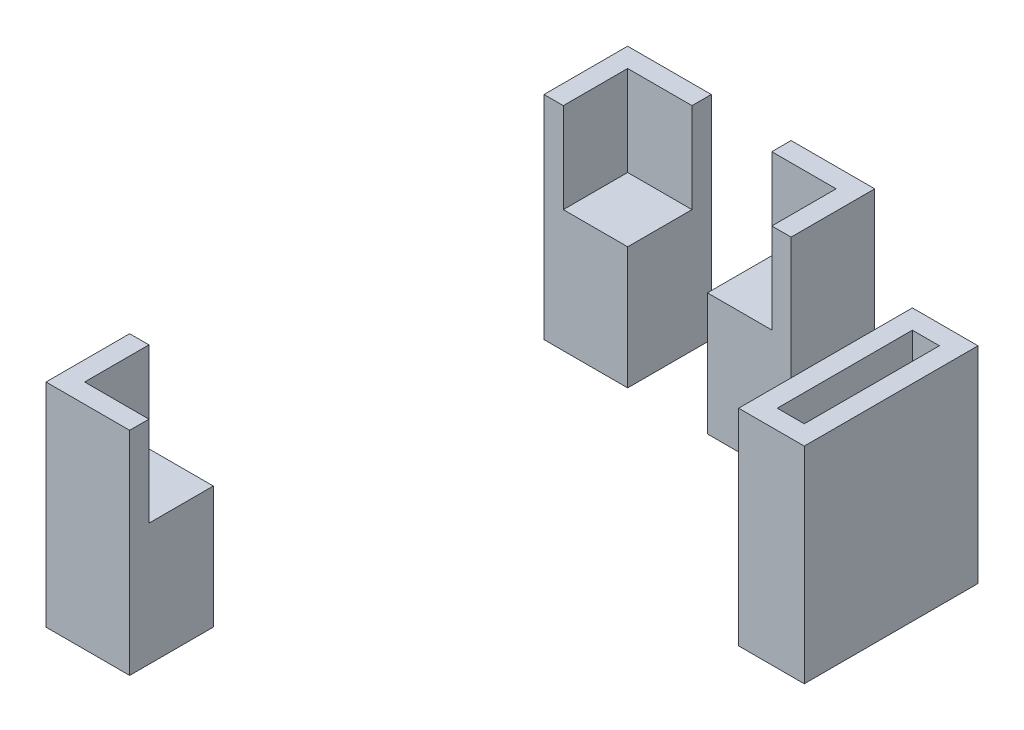
ISO-10303-21;
HEADER;
FILE_DESCRIPTION(('STEP AP214'),'2;1');
FILE_NAME('part.step','',(''),(''),'','','');
FILE_SCHEMA(('AUTOMOTIVE_DESIGN { 1 0 10303 214 1 1 1 1 }'));
ENDSEC;
DATA;
#1=APPLICATION_CONTEXT('core data for automotive mechanical design processes');
#2=APPLICATION_PROTOCOL_DEFINITION('international standard','automotive_design',2000,#1);
#3=PRODUCT_CONTEXT('',#1,'mechanical');
#4=PRODUCT('Part','Part','',(#3));
#5=PRODUCT_RELATED_PRODUCT_CATEGORY('part','',(#4));
#6=PRODUCT_DEFINITION_FORMATION('','',#4);
#7=PRODUCT_DEFINITION_CONTEXT('part definition',#1,'design');
#8=PRODUCT_DEFINITION('design','',#6,#7);
#9=PRODUCT_DEFINITION_SHAPE('','',#8);
#10=(LENGTH_UNIT() NAMED_UNIT(*) SI_UNIT(.MILLI.,.METRE.));
#11=(NAMED_UNIT(*) PLANE_ANGLE_UNIT() SI_UNIT($,.RADIAN.));
#12=(NAMED_UNIT(*) SI_UNIT($,.STERADIAN.) SOLID_ANGLE_UNIT());
#13=UNCERTAINTY_MEASURE_WITH_UNIT(LENGTH_MEASURE(1.E-05),#10,'distance_accuracy_value','');
#14=(GEOMETRIC_REPRESENTATION_CONTEXT(3) GLOBAL_UNCERTAINTY_ASSIGNED_CONTEXT((#13)) GLOBAL_UNIT_ASSIGNED_CONTEXT((#10,
#11,#12)) REPRESENTATION_CONTEXT('',''));
#15=CARTESIAN_POINT('',(0.,0.,0.));
#16=DIRECTION('',(0.,0.,1.));
#17=DIRECTION('',(1.,0.,0.));
#18=AXIS2_PLACEMENT_3D('',#15,#16,#17);
#19=CARTESIAN_POINT('',(26.675,16.5,4.55));
#20=DIRECTION('',(1.,0.,0.));
#21=DIRECTION('',(0.,0.,-1.));
#22=AXIS2_PLACEMENT_3D('',#19,#20,#21);
#23=PLANE('',#22);
#24=DIRECTION('',(0.,0.,1.));
#25=VECTOR('',#24,1.);
#26=CARTESIAN_POINT('',(26.675,16.,4.55));
#27=LINE('',#26,#25);
#28=CARTESIAN_POINT('',(26.675,16.,4.55));
#29=VERTEX_POINT('',#28);
#30=CARTESIAN_POINT('',(26.675,16.,18.05));
#31=VERTEX_POINT('',#30);
#32=EDGE_CURVE('E134',#29,#31,#27,.T.);
#33=ORIENTED_EDGE('',*,*,#32,.F.);
#34=DIRECTION('',(0.,-1.,0.));
#35=VECTOR('',#34,1.);
#36=CARTESIAN_POINT('',(26.675,16.5,4.55));
#37=LINE('',#36,#35);
#38=CARTESIAN_POINT('',(26.675,0.,4.55));
#39=VERTEX_POINT('',#38);
#40=EDGE_CURVE('E165',#29,#39,#37,.T.);
#41=ORIENTED_EDGE('',*,*,#40,.T.);
#42=DIRECTION('',(0.,0.,1.));
#43=VECTOR('',#42,1.);
#44=CARTESIAN_POINT('',(26.675,0.,4.55));
#45=LINE('',#44,#43);
#46=CARTESIAN_POINT('',(26.675,0.,18.05));
#47=VERTEX_POINT('',#46);
#48=EDGE_CURVE('E153',#39,#47,#45,.T.);
#49=ORIENTED_EDGE('',*,*,#48,.T.);
#50=DIRECTION('',(0.,-1.,0.));
#51=VECTOR('',#50,1.);
#52=CARTESIAN_POINT('',(26.675,16.5,18.05));
#53=LINE('',#52,#51);
#54=EDGE_CURVE('E54',#31,#47,#53,.T.);
#55=ORIENTED_EDGE('',*,*,#54,.F.);
#56=EDGE_LOOP('',(#33,#41,#49,#55));
#57=FACE_BOUND('',#56,.T.);
#58=ADVANCED_FACE('F47',(#57),#23,.F.);
#59=CARTESIAN_POINT('',(26.675,16.5,18.05));
#60=DIRECTION('',(0.,0.,-1.));
#61=DIRECTION('',(-1.,0.,0.));
#62=AXIS2_PLACEMENT_3D('',#59,#60,#61);
#63=PLANE('',#62);
#64=DIRECTION('',(1.,0.,0.));
#65=VECTOR('',#64,1.);
#66=CARTESIAN_POINT('',(26.675,16.,18.05));
#67=LINE('',#66,#65);
#68=CARTESIAN_POINT('',(31.775,16.,18.05));
#69=VERTEX_POINT('',#68);
#70=EDGE_CURVE('E136',#31,#69,#67,.T.);
#71=ORIENTED_EDGE('',*,*,#70,.F.);
#72=ORIENTED_EDGE('',*,*,#54,.T.);
#73=DIRECTION('',(1.,0.,0.));
#74=VECTOR('',#73,1.);
#75=CARTESIAN_POINT('',(26.675,0.,18.05));
#76=LINE('',#75,#74);
#77=CARTESIAN_POINT('',(31.775,0.,18.05));
#78=VERTEX_POINT('',#77);
#79=EDGE_CURVE('E156',#47,#78,#76,.T.);
#80=ORIENTED_EDGE('',*,*,#79,.T.);
#81=DIRECTION('',(0.,-1.,0.));
#82=VECTOR('',#81,1.);
#83=CARTESIAN_POINT('',(31.775,16.5,18.05));
#84=LINE('',#83,#82);
#85=EDGE_CURVE('E169',#69,#78,#84,.T.);
#86=ORIENTED_EDGE('',*,*,#85,.F.);
#87=EDGE_LOOP('',(#71,#72,#80,#86));
#88=FACE_BOUND('',#87,.T.);
#89=ADVANCED_FACE('F174',(#88),#63,.F.);
#90=CARTESIAN_POINT('',(31.775,16.5,4.55));
#91=DIRECTION('',(-1.,0.,0.));
#92=DIRECTION('',(0.,0.,1.));
#93=AXIS2_PLACEMENT_3D('',#90,#91,#92);
#94=PLANE('',#93);
#95=DIRECTION('',(0.,0.,-1.));
#96=VECTOR('',#95,1.);
#97=CARTESIAN_POINT('',(31.775,16.,4.55));
#98=LINE('',#97,#96);
#99=CARTESIAN_POINT('',(31.775,16.,4.55));
#100=VERTEX_POINT('',#99);
#101=EDGE_CURVE('E138',#69,#100,#98,.T.);
#102=ORIENTED_EDGE('',*,*,#101,.F.);
#103=ORIENTED_EDGE('',*,*,#85,.T.);
#104=DIRECTION('',(0.,0.,-1.));
#105=VECTOR('',#104,1.);
#106=CARTESIAN_POINT('',(31.775,0.,4.55));
#107=LINE('',#106,#105);
#108=CARTESIAN_POINT('',(31.775,0.,4.55));
#109=VERTEX_POINT('',#108);
#110=EDGE_CURVE('E159',#78,#109,#107,.T.);
#111=ORIENTED_EDGE('',*,*,#110,.T.);
#112=DIRECTION('',(0.,-1.,0.));
#113=VECTOR('',#112,1.);
#114=CARTESIAN_POINT('',(31.775,16.5,4.55));
#115=LINE('',#114,#113);
#116=EDGE_CURVE('E167',#100,#109,#115,.T.);
#117=ORIENTED_EDGE('',*,*,#116,.F.);
#118=EDGE_LOOP('',(#102,#103,#111,#117));
#119=FACE_BOUND('',#118,.T.);
#120=ADVANCED_FACE('F190',(#119),#94,.F.);
#121=CARTESIAN_POINT('',(26.675,16.5,4.55));
#122=DIRECTION('',(0.,0.,1.));
#123=DIRECTION('',(1.,0.,0.));
#124=AXIS2_PLACEMENT_3D('',#121,#122,#123);
#125=PLANE('',#124);
#126=DIRECTION('',(-1.,0.,0.));
#127=VECTOR('',#126,1.);
#128=CARTESIAN_POINT('',(26.675,16.,4.55));
#129=LINE('',#128,#127);
#130=EDGE_CURVE('E140',#100,#29,#129,.T.);
#131=ORIENTED_EDGE('',*,*,#130,.F.);
#132=ORIENTED_EDGE('',*,*,#116,.T.);
#133=DIRECTION('',(-1.,0.,0.));
#134=VECTOR('',#133,1.);
#135=CARTESIAN_POINT('',(26.675,0.,4.55));
#136=LINE('',#135,#134);
#137=EDGE_CURVE('E162',#109,#39,#136,.T.);
#138=ORIENTED_EDGE('',*,*,#137,.T.);
#139=ORIENTED_EDGE('',*,*,#40,.F.);
#140=EDGE_LOOP('',(#131,#132,#138,#139));
#141=FACE_BOUND('',#140,.T.);
#142=ADVANCED_FACE('F186',(#141),#125,.F.);
#143=CARTESIAN_POINT('',(28.175,16.5,6.05));
#144=DIRECTION('',(1.,0.,0.));
#145=DIRECTION('',(0.,0.,-1.));
#146=AXIS2_PLACEMENT_3D('',#143,#144,#145);
#147=PLANE('',#146);
#148=DIRECTION('',(0.,0.,1.));
#149=VECTOR('',#148,1.);
#150=CARTESIAN_POINT('',(28.175,13.,6.05));
#151=LINE('',#150,#149);
#152=CARTESIAN_POINT('',(28.175,13.,6.05));
#153=VERTEX_POINT('',#152);
#154=CARTESIAN_POINT('',(28.175,13.,16.55));
#155=VERTEX_POINT('',#154);
#156=EDGE_CURVE('E125',#153,#155,#151,.T.);
#157=ORIENTED_EDGE('',*,*,#156,.F.);
#158=DIRECTION('',(0.,-1.,0.));
#159=VECTOR('',#158,1.);
#160=CARTESIAN_POINT('',(28.175,16.5,6.05));
#161=LINE('',#160,#159);
#162=CARTESIAN_POINT('',(28.175,16.,6.05));
#163=VERTEX_POINT('',#162);
#164=EDGE_CURVE('E113',#163,#153,#161,.T.);
#165=ORIENTED_EDGE('',*,*,#164,.F.);
#166=DIRECTION('',(0.,0.,1.));
#167=VECTOR('',#166,1.);
#168=CARTESIAN_POINT('',(28.175,16.,6.05));
#169=LINE('',#168,#167);
#170=CARTESIAN_POINT('',(28.175,16.,16.55));
#171=VERTEX_POINT('',#170);
#172=EDGE_CURVE('E122',#163,#171,#169,.T.);
#173=ORIENTED_EDGE('',*,*,#172,.T.);
#174=DIRECTION('',(0.,-1.,0.));
#175=VECTOR('',#174,1.);
#176=CARTESIAN_POINT('',(28.175,16.5,16.55));
#177=LINE('',#176,#175);
#178=EDGE_CURVE('E127',#171,#155,#177,.T.);
#179=ORIENTED_EDGE('',*,*,#178,.T.);
#180=EDGE_LOOP('',(#157,#165,#173,#179));
#181=FACE_BOUND('',#180,.T.);
#182=ADVANCED_FACE('F126',(#181),#147,.T.);
#183=CARTESIAN_POINT('',(28.175,16.5,16.55));
#184=DIRECTION('',(0.,0.,-1.));
#185=DIRECTION('',(-1.,0.,0.));
#186=AXIS2_PLACEMENT_3D('',#183,#184,#185);
#187=PLANE('',#186);
#188=DIRECTION('',(1.,0.,0.));
#189=VECTOR('',#188,1.);
#190=CARTESIAN_POINT('',(28.175,13.,16.55));
#191=LINE('',#190,#189);
#192=CARTESIAN_POINT('',(30.275,13.,16.55));
#193=VERTEX_POINT('',#192);
#194=EDGE_CURVE('E61',#155,#193,#191,.T.);
#195=ORIENTED_EDGE('',*,*,#194,.F.);
#196=ORIENTED_EDGE('',*,*,#178,.F.);
#197=DIRECTION('',(1.,0.,0.));
#198=VECTOR('',#197,1.);
#199=CARTESIAN_POINT('',(28.175,16.,16.55));
#200=LINE('',#199,#198);
#201=CARTESIAN_POINT('',(30.275,16.,16.55));
#202=VERTEX_POINT('',#201);
#203=EDGE_CURVE('E145',#171,#202,#200,.T.);
#204=ORIENTED_EDGE('',*,*,#203,.T.);
#205=DIRECTION('',(0.,-1.,0.));
#206=VECTOR('',#205,1.);
#207=CARTESIAN_POINT('',(30.275,16.5,16.55));
#208=LINE('',#207,#206);
#209=EDGE_CURVE('E150',#202,#193,#208,.T.);
#210=ORIENTED_EDGE('',*,*,#209,.T.);
#211=EDGE_LOOP('',(#195,#196,#204,#210));
#212=FACE_BOUND('',#211,.T.);
#213=ADVANCED_FACE('F216',(#212),#187,.T.);
#214=CARTESIAN_POINT('',(30.275,16.5,6.05));
#215=DIRECTION('',(-1.,0.,0.));
#216=DIRECTION('',(0.,0.,1.));
#217=AXIS2_PLACEMENT_3D('',#214,#215,#216);
#218=PLANE('',#217);
#219=DIRECTION('',(0.,0.,-1.));
#220=VECTOR('',#219,1.);
#221=CARTESIAN_POINT('',(30.275,13.,6.05));
#222=LINE('',#221,#220);
#223=CARTESIAN_POINT('',(30.275,13.,6.05));
#224=VERTEX_POINT('',#223);
#225=EDGE_CURVE('E69',#193,#224,#222,.T.);
#226=ORIENTED_EDGE('',*,*,#225,.F.);
#227=ORIENTED_EDGE('',*,*,#209,.F.);
#228=DIRECTION('',(0.,0.,-1.));
#229=VECTOR('',#228,1.);
#230=CARTESIAN_POINT('',(30.275,16.,6.05));
#231=LINE('',#230,#229);
#232=CARTESIAN_POINT('',(30.275,16.,6.05));
#233=VERTEX_POINT('',#232);
#234=EDGE_CURVE('E142',#202,#233,#231,.T.);
#235=ORIENTED_EDGE('',*,*,#234,.T.);
#236=DIRECTION('',(0.,-1.,0.));
#237=VECTOR('',#236,1.);
#238=CARTESIAN_POINT('',(30.275,16.5,6.05));
#239=LINE('',#238,#237);
#240=EDGE_CURVE('E121',#233,#224,#239,.T.);
#241=ORIENTED_EDGE('',*,*,#240,.T.);
#242=EDGE_LOOP('',(#226,#227,#235,#241));
#243=FACE_BOUND('',#242,.T.);
#244=ADVANCED_FACE('F219',(#243),#218,.T.);
#245=CARTESIAN_POINT('',(28.175,16.5,6.05));
#246=DIRECTION('',(0.,0.,1.));
#247=DIRECTION('',(1.,0.,0.));
#248=AXIS2_PLACEMENT_3D('',#245,#246,#247);
#249=PLANE('',#248);
#250=DIRECTION('',(-1.,0.,0.));
#251=VECTOR('',#250,1.);
#252=CARTESIAN_POINT('',(28.175,13.,6.05));
#253=LINE('',#252,#251);
#254=EDGE_CURVE('E118',#224,#153,#253,.T.);
#255=ORIENTED_EDGE('',*,*,#254,.F.);
#256=ORIENTED_EDGE('',*,*,#240,.F.);
#257=DIRECTION('',(-1.,0.,0.));
#258=VECTOR('',#257,1.);
#259=CARTESIAN_POINT('',(28.175,16.,6.05));
#260=LINE('',#259,#258);
#261=EDGE_CURVE('E13',#233,#163,#260,.T.);
#262=ORIENTED_EDGE('',*,*,#261,.T.);
#263=ORIENTED_EDGE('',*,*,#164,.T.);
#264=EDGE_LOOP('',(#255,#256,#262,#263));
#265=FACE_BOUND('',#264,.T.);
#266=ADVANCED_FACE('F115',(#265),#249,.T.);
#267=CARTESIAN_POINT('',(0.,0.,0.));
#268=DIRECTION('',(0.,1.,0.));
#269=DIRECTION('',(0.,0.,1.));
#270=AXIS2_PLACEMENT_3D('',#267,#268,#269);
#271=PLANE('',#270);
#272=ORIENTED_EDGE('',*,*,#48,.F.);
#273=ORIENTED_EDGE('',*,*,#137,.F.);
#274=ORIENTED_EDGE('',*,*,#110,.F.);
#275=ORIENTED_EDGE('',*,*,#79,.F.);
#276=EDGE_LOOP('',(#272,#273,#274,#275));
#277=FACE_BOUND('',#276,.T.);
#278=ADVANCED_FACE('F181',(#277),#271,.F.);
#279=CARTESIAN_POINT('',(0.,16.,0.));
#280=DIRECTION('',(0.,1.,0.));
#281=DIRECTION('',(0.,0.,1.));
#282=AXIS2_PLACEMENT_3D('',#279,#280,#281);
#283=PLANE('',#282);
#284=ORIENTED_EDGE('',*,*,#261,.F.);
#285=ORIENTED_EDGE('',*,*,#234,.F.);
#286=ORIENTED_EDGE('',*,*,#203,.F.);
#287=ORIENTED_EDGE('',*,*,#172,.F.);
#288=EDGE_LOOP('',(#284,#285,#286,#287));
#289=FACE_BOUND('',#288,.T.);
#290=ORIENTED_EDGE('',*,*,#32,.T.);
#291=ORIENTED_EDGE('',*,*,#70,.T.);
#292=ORIENTED_EDGE('',*,*,#101,.T.);
#293=ORIENTED_EDGE('',*,*,#130,.T.);
#294=EDGE_LOOP('',(#290,#291,#292,#293));
#295=FACE_BOUND('',#294,.T.);
#296=ADVANCED_FACE('F192',(#289,#295),#283,.T.);
#297=CARTESIAN_POINT('',(0.,13.,0.));
#298=DIRECTION('',(0.,1.,0.));
#299=DIRECTION('',(0.,0.,1.));
#300=AXIS2_PLACEMENT_3D('',#297,#298,#299);
#301=PLANE('',#300);
#302=ORIENTED_EDGE('',*,*,#254,.T.);
#303=ORIENTED_EDGE('',*,*,#156,.T.);
#304=ORIENTED_EDGE('',*,*,#194,.T.);
#305=ORIENTED_EDGE('',*,*,#225,.T.);
#306=EDGE_LOOP('',(#302,#303,#304,#305));
#307=FACE_BOUND('',#306,.T.);
#308=ADVANCED_FACE('F130',(#307),#301,.T.);
#309=CLOSED_SHELL('',(#58,#89,#120,#142,#182,#213,#244,#266,#278,#296,#308));
#310=MANIFOLD_SOLID_BREP('B2',#309);
#311=CARTESIAN_POINT('',(-1.5,16.5,37.2));
#312=DIRECTION('',(0.,0.,1.));
#313=DIRECTION('',(1.,0.,0.));
#314=AXIS2_PLACEMENT_3D('',#311,#312,#313);
#315=PLANE('',#314);
#316=DIRECTION('',(-1.,0.,0.));
#317=VECTOR('',#316,1.);
#318=CARTESIAN_POINT('',(-1.5,0.,37.2));
#319=LINE('',#318,#317);
#320=CARTESIAN_POINT('',(5.,0.,37.2));
#321=VERTEX_POINT('',#320);
#322=CARTESIAN_POINT('',(-1.5,0.,37.2));
#323=VERTEX_POINT('',#322);
#324=EDGE_CURVE('E373',#321,#323,#319,.T.);
#325=ORIENTED_EDGE('',*,*,#324,.T.);
#326=DIRECTION('',(0.,-1.,0.));
#327=VECTOR('',#326,1.);
#328=CARTESIAN_POINT('',(-1.5,16.5,37.2));
#329=LINE('',#328,#327);
#330=CARTESIAN_POINT('',(-1.5,16.5,37.2));
#331=VERTEX_POINT('',#330);
#332=EDGE_CURVE('E45',#331,#323,#329,.T.);
#333=ORIENTED_EDGE('',*,*,#332,.F.);
#334=DIRECTION('',(-1.,0.,0.));
#335=VECTOR('',#334,1.);
#336=CARTESIAN_POINT('',(-1.5,16.5,37.2));
#337=LINE('',#336,#335);
#338=CARTESIAN_POINT('',(0.,16.5,37.2));
#339=VERTEX_POINT('',#338);
#340=EDGE_CURVE('E382',#339,#331,#337,.T.);
#341=ORIENTED_EDGE('',*,*,#340,.F.);
#342=DIRECTION('',(0.,-1.,0.));
#343=VECTOR('',#342,1.);
#344=CARTESIAN_POINT('',(0.,16.5,37.2));
#345=LINE('',#344,#343);
#346=CARTESIAN_POINT('',(0.,9.5,37.2));
#347=VERTEX_POINT('',#346);
#348=EDGE_CURVE('E378',#339,#347,#345,.T.);
#349=ORIENTED_EDGE('',*,*,#348,.T.);
#350=DIRECTION('',(-1.,0.,0.));
#351=VECTOR('',#350,1.);
#352=CARTESIAN_POINT('',(0.,9.5,37.2));
#353=LINE('',#352,#351);
#354=CARTESIAN_POINT('',(5.,9.5,37.2));
#355=VERTEX_POINT('',#354);
#356=EDGE_CURVE('E361',#355,#347,#353,.T.);
#357=ORIENTED_EDGE('',*,*,#356,.F.);
#358=DIRECTION('',(0.,-1.,0.));
#359=VECTOR('',#358,1.);
#360=CARTESIAN_POINT('',(5.,9.5,37.2));
#361=LINE('',#360,#359);
#362=EDGE_CURVE('E366',#355,#321,#361,.T.);
#363=ORIENTED_EDGE('',*,*,#362,.T.);
#364=EDGE_LOOP('',(#325,#333,#341,#349,#357,#363));
#365=FACE_BOUND('',#364,.T.);
#366=ADVANCED_FACE('F298',(#365),#315,.F.);
#367=CARTESIAN_POINT('',(-1.5,16.5,37.2));
#368=DIRECTION('',(1.,0.,0.));
#369=DIRECTION('',(0.,0.,-1.));
#370=AXIS2_PLACEMENT_3D('',#367,#368,#369);
#371=PLANE('',#370);
#372=DIRECTION('',(0.,0.,1.));
#373=VECTOR('',#372,1.);
#374=CARTESIAN_POINT('',(-1.5,0.,37.2));
#375=LINE('',#374,#373);
#376=CARTESIAN_POINT('',(-1.5,0.,43.7));
#377=VERTEX_POINT('',#376);
#378=EDGE_CURVE('E396',#323,#377,#375,.T.);
#379=ORIENTED_EDGE('',*,*,#378,.T.);
#380=DIRECTION('',(0.,-1.,0.));
#381=VECTOR('',#380,1.);
#382=CARTESIAN_POINT('',(-1.5,16.5,43.7));
#383=LINE('',#382,#381);
#384=CARTESIAN_POINT('',(-1.5,16.5,43.7));
#385=VERTEX_POINT('',#384);
#386=EDGE_CURVE('E305',#385,#377,#383,.T.);
#387=ORIENTED_EDGE('',*,*,#386,.F.);
#388=DIRECTION('',(0.,0.,1.));
#389=VECTOR('',#388,1.);
#390=CARTESIAN_POINT('',(-1.5,16.5,37.2));
#391=LINE('',#390,#389);
#392=EDGE_CURVE('E385',#331,#385,#391,.T.);
#393=ORIENTED_EDGE('',*,*,#392,.F.);
#394=ORIENTED_EDGE('',*,*,#332,.T.);
#395=EDGE_LOOP('',(#379,#387,#393,#394));
#396=FACE_BOUND('',#395,.T.);
#397=ADVANCED_FACE('F417',(#396),#371,.F.);
#398=CARTESIAN_POINT('',(-1.5,16.5,43.7));
#399=DIRECTION('',(0.,0.,-1.));
#400=DIRECTION('',(-1.,0.,0.));
#401=AXIS2_PLACEMENT_3D('',#398,#399,#400);
#402=PLANE('',#401);
#403=DIRECTION('',(1.,0.,0.));
#404=VECTOR('',#403,1.);
#405=CARTESIAN_POINT('',(-1.5,0.,43.7));
#406=LINE('',#405,#404);
#407=CARTESIAN_POINT('',(5.,0.,43.7));
#408=VERTEX_POINT('',#407);
#409=EDGE_CURVE('E398',#377,#408,#406,.T.);
#410=ORIENTED_EDGE('',*,*,#409,.T.);
#411=DIRECTION('',(0.,-1.,0.));
#412=VECTOR('',#411,1.);
#413=CARTESIAN_POINT('',(5.,16.5,43.7));
#414=LINE('',#413,#412);
#415=CARTESIAN_POINT('',(5.,16.5,43.7));
#416=VERTEX_POINT('',#415);
#417=EDGE_CURVE('E405',#416,#408,#414,.T.);
#418=ORIENTED_EDGE('',*,*,#417,.F.);
#419=DIRECTION('',(1.,0.,0.));
#420=VECTOR('',#419,1.);
#421=CARTESIAN_POINT('',(-1.5,16.5,43.7));
#422=LINE('',#421,#420);
#423=EDGE_CURVE('E387',#385,#416,#422,.T.);
#424=ORIENTED_EDGE('',*,*,#423,.F.);
#425=ORIENTED_EDGE('',*,*,#386,.T.);
#426=EDGE_LOOP('',(#410,#418,#424,#425));
#427=FACE_BOUND('',#426,.T.);
#428=ADVANCED_FACE('F411',(#427),#402,.F.);
#429=CARTESIAN_POINT('',(5.,16.5,42.2));
#430=DIRECTION('',(-1.,0.,0.));
#431=DIRECTION('',(0.,0.,1.));
#432=AXIS2_PLACEMENT_3D('',#429,#430,#431);
#433=PLANE('',#432);
#434=DIRECTION('',(0.,0.,-1.));
#435=VECTOR('',#434,1.);
#436=CARTESIAN_POINT('',(5.,0.,42.2));
#437=LINE('',#436,#435);
#438=EDGE_CURVE('E370',#408,#321,#437,.T.);
#439=ORIENTED_EDGE('',*,*,#438,.T.);
#440=ORIENTED_EDGE('',*,*,#362,.F.);
#441=DIRECTION('',(0.,0.,-1.));
#442=VECTOR('',#441,1.);
#443=CARTESIAN_POINT('',(5.,9.5,37.2));
#444=LINE('',#443,#442);
#445=CARTESIAN_POINT('',(5.,9.5,42.2));
#446=VERTEX_POINT('',#445);
#447=EDGE_CURVE('E356',#446,#355,#444,.T.);
#448=ORIENTED_EDGE('',*,*,#447,.F.);
#449=DIRECTION('',(0.,-1.,0.));
#450=VECTOR('',#449,1.);
#451=CARTESIAN_POINT('',(5.,16.5,42.2));
#452=LINE('',#451,#450);
#453=CARTESIAN_POINT('',(5.,16.5,42.2));
#454=VERTEX_POINT('',#453);
#455=EDGE_CURVE('E312',#454,#446,#452,.T.);
#456=ORIENTED_EDGE('',*,*,#455,.F.);
#457=DIRECTION('',(0.,0.,-1.));
#458=VECTOR('',#457,1.);
#459=CARTESIAN_POINT('',(5.,16.5,42.2));
#460=LINE('',#459,#458);
#461=EDGE_CURVE('E389',#416,#454,#460,.T.);
#462=ORIENTED_EDGE('',*,*,#461,.F.);
#463=ORIENTED_EDGE('',*,*,#417,.T.);
#464=EDGE_LOOP('',(#439,#440,#448,#456,#462,#463));
#465=FACE_BOUND('',#464,.T.);
#466=ADVANCED_FACE('F367',(#465),#433,.F.);
#467=CARTESIAN_POINT('',(0.,16.5,42.2));
#468=DIRECTION('',(0.,0.,1.));
#469=DIRECTION('',(1.,0.,0.));
#470=AXIS2_PLACEMENT_3D('',#467,#468,#469);
#471=PLANE('',#470);
#472=ORIENTED_EDGE('',*,*,#455,.T.);
#473=DIRECTION('',(1.,0.,0.));
#474=VECTOR('',#473,1.);
#475=CARTESIAN_POINT('',(0.,9.5,42.2));
#476=LINE('',#475,#474);
#477=CARTESIAN_POINT('',(0.,9.5,42.2));
#478=VERTEX_POINT('',#477);
#479=EDGE_CURVE('E316',#478,#446,#476,.T.);
#480=ORIENTED_EDGE('',*,*,#479,.F.);
#481=DIRECTION('',(0.,-1.,0.));
#482=VECTOR('',#481,1.);
#483=CARTESIAN_POINT('',(0.,16.5,42.2));
#484=LINE('',#483,#482);
#485=CARTESIAN_POINT('',(0.,16.5,42.2));
#486=VERTEX_POINT('',#485);
#487=EDGE_CURVE('E402',#486,#478,#484,.T.);
#488=ORIENTED_EDGE('',*,*,#487,.F.);
#489=DIRECTION('',(-1.,0.,0.));
#490=VECTOR('',#489,1.);
#491=CARTESIAN_POINT('',(0.,16.5,42.2));
#492=LINE('',#491,#490);
#493=EDGE_CURVE('E391',#454,#486,#492,.T.);
#494=ORIENTED_EDGE('',*,*,#493,.F.);
#495=EDGE_LOOP('',(#472,#480,#488,#494));
#496=FACE_BOUND('',#495,.T.);
#497=ADVANCED_FACE('F425',(#496),#471,.F.);
#498=CARTESIAN_POINT('',(0.,16.5,37.2));
#499=DIRECTION('',(-1.,0.,0.));
#500=DIRECTION('',(0.,0.,1.));
#501=AXIS2_PLACEMENT_3D('',#498,#499,#500);
#502=PLANE('',#501);
#503=ORIENTED_EDGE('',*,*,#487,.T.);
#504=DIRECTION('',(0.,0.,1.));
#505=VECTOR('',#504,1.);
#506=CARTESIAN_POINT('',(0.,9.5,37.2));
#507=LINE('',#506,#505);
#508=EDGE_CURVE('E423',#347,#478,#507,.T.);
#509=ORIENTED_EDGE('',*,*,#508,.F.);
#510=ORIENTED_EDGE('',*,*,#348,.F.);
#511=DIRECTION('',(0.,0.,-1.));
#512=VECTOR('',#511,1.);
#513=CARTESIAN_POINT('',(0.,16.5,37.2));
#514=LINE('',#513,#512);
#515=EDGE_CURVE('E393',#486,#339,#514,.T.);
#516=ORIENTED_EDGE('',*,*,#515,.F.);
#517=EDGE_LOOP('',(#503,#509,#510,#516));
#518=FACE_BOUND('',#517,.T.);
#519=ADVANCED_FACE('F422',(#518),#502,.F.);
#520=CARTESIAN_POINT('',(0.,16.5,0.));
#521=DIRECTION('',(0.,-1.,0.));
#522=DIRECTION('',(0.,0.,-1.));
#523=AXIS2_PLACEMENT_3D('',#520,#521,#522);
#524=PLANE('',#523);
#525=ORIENTED_EDGE('',*,*,#340,.T.);
#526=ORIENTED_EDGE('',*,*,#392,.T.);
#527=ORIENTED_EDGE('',*,*,#423,.T.);
#528=ORIENTED_EDGE('',*,*,#461,.T.);
#529=ORIENTED_EDGE('',*,*,#493,.T.);
#530=ORIENTED_EDGE('',*,*,#515,.T.);
#531=EDGE_LOOP('',(#525,#526,#527,#528,#529,#530));
#532=FACE_BOUND('',#531,.T.);
#533=ADVANCED_FACE('F419',(#532),#524,.F.);
#534=CARTESIAN_POINT('',(0.,0.,0.));
#535=DIRECTION('',(0.,-1.,0.));
#536=DIRECTION('',(0.,0.,-1.));
#537=AXIS2_PLACEMENT_3D('',#534,#535,#536);
#538=PLANE('',#537);
#539=ORIENTED_EDGE('',*,*,#324,.F.);
#540=ORIENTED_EDGE('',*,*,#438,.F.);
#541=ORIENTED_EDGE('',*,*,#409,.F.);
#542=ORIENTED_EDGE('',*,*,#378,.F.);
#543=EDGE_LOOP('',(#539,#540,#541,#542));
#544=FACE_BOUND('',#543,.T.);
#545=ADVANCED_FACE('F415',(#544),#538,.T.);
#546=CARTESIAN_POINT('',(0.,9.5,0.));
#547=DIRECTION('',(0.,1.,0.));
#548=DIRECTION('',(0.,0.,1.));
#549=AXIS2_PLACEMENT_3D('',#546,#547,#548);
#550=PLANE('',#549);
#551=ORIENTED_EDGE('',*,*,#508,.T.);
#552=ORIENTED_EDGE('',*,*,#479,.T.);
#553=ORIENTED_EDGE('',*,*,#447,.T.);
#554=ORIENTED_EDGE('',*,*,#356,.T.);
#555=EDGE_LOOP('',(#551,#552,#553,#554));
#556=FACE_BOUND('',#555,.T.);
#557=ADVANCED_FACE('F359',(#556),#550,.T.);
#558=CLOSED_SHELL('',(#366,#397,#428,#466,#497,#519,#533,#545,#557));
#559=MANIFOLD_SOLID_BREP('B7',#558);
#560=CARTESIAN_POINT('',(11.2,16.5,0.));
#561=DIRECTION('',(1.,0.,0.));
#562=DIRECTION('',(0.,0.,-1.));
#563=AXIS2_PLACEMENT_3D('',#560,#561,#562);
#564=PLANE('',#563);
#565=DIRECTION('',(0.,0.,1.));
#566=VECTOR('',#565,1.);
#567=CARTESIAN_POINT('',(11.2,0.,0.));
#568=LINE('',#567,#566);
#569=CARTESIAN_POINT('',(11.2,0.,-1.5));
#570=VERTEX_POINT('',#569);
#571=CARTESIAN_POINT('',(11.2,0.,5.));
#572=VERTEX_POINT('',#571);
#573=EDGE_CURVE('E593',#570,#572,#568,.T.);
#574=ORIENTED_EDGE('',*,*,#573,.T.);
#575=DIRECTION('',(0.,-1.,0.));
#576=VECTOR('',#575,1.);
#577=CARTESIAN_POINT('',(11.2,9.5,5.));
#578=LINE('',#577,#576);
#579=CARTESIAN_POINT('',(11.2,9.5,5.));
#580=VERTEX_POINT('',#579);
#581=EDGE_CURVE('E577',#580,#572,#578,.T.);
#582=ORIENTED_EDGE('',*,*,#581,.F.);
#583=DIRECTION('',(0.,0.,1.));
#584=VECTOR('',#583,1.);
#585=CARTESIAN_POINT('',(11.2,9.5,0.));
#586=LINE('',#585,#584);
#587=CARTESIAN_POINT('',(11.2,9.5,0.));
#588=VERTEX_POINT('',#587);
#589=EDGE_CURVE('E584',#588,#580,#586,.T.);
#590=ORIENTED_EDGE('',*,*,#589,.F.);
#591=DIRECTION('',(0.,-1.,0.));
#592=VECTOR('',#591,1.);
#593=CARTESIAN_POINT('',(11.2,16.5,0.));
#594=LINE('',#593,#592);
#595=CARTESIAN_POINT('',(11.2,16.5,0.));
#596=VERTEX_POINT('',#595);
#597=EDGE_CURVE('E296',#596,#588,#594,.T.);
#598=ORIENTED_EDGE('',*,*,#597,.F.);
#599=DIRECTION('',(0.,0.,1.));
#600=VECTOR('',#599,1.);
#601=CARTESIAN_POINT('',(11.2,16.5,0.));
#602=LINE('',#601,#600);
#603=CARTESIAN_POINT('',(11.2,16.5,-1.5));
#604=VERTEX_POINT('',#603);
#605=EDGE_CURVE('E600',#604,#596,#602,.T.);
#606=ORIENTED_EDGE('',*,*,#605,.F.);
#607=DIRECTION('',(0.,-1.,0.));
#608=VECTOR('',#607,1.);
#609=CARTESIAN_POINT('',(11.2,16.5,-1.5));
#610=LINE('',#609,#608);
#611=EDGE_CURVE('E613',#604,#570,#610,.T.);
#612=ORIENTED_EDGE('',*,*,#611,.T.);
#613=EDGE_LOOP('',(#574,#582,#590,#598,#606,#612));
#614=FACE_BOUND('',#613,.T.);
#615=ADVANCED_FACE('F517',(#614),#564,.F.);
#616=CARTESIAN_POINT('',(11.2,16.5,0.));
#617=DIRECTION('',(0.,0.,-1.));
#618=DIRECTION('',(-1.,0.,0.));
#619=AXIS2_PLACEMENT_3D('',#616,#617,#618);
#620=PLANE('',#619);
#621=ORIENTED_EDGE('',*,*,#597,.T.);
#622=DIRECTION('',(-1.,0.,0.));
#623=VECTOR('',#622,1.);
#624=CARTESIAN_POINT('',(11.2,9.5,0.));
#625=LINE('',#624,#623);
#626=CARTESIAN_POINT('',(16.2,9.5,0.));
#627=VERTEX_POINT('',#626);
#628=EDGE_CURVE('E533',#627,#588,#625,.T.);
#629=ORIENTED_EDGE('',*,*,#628,.F.);
#630=DIRECTION('',(0.,-1.,0.));
#631=VECTOR('',#630,1.);
#632=CARTESIAN_POINT('',(16.2,16.5,0.));
#633=LINE('',#632,#631);
#634=CARTESIAN_POINT('',(16.2,16.5,0.));
#635=VERTEX_POINT('',#634);
#636=EDGE_CURVE('E524',#635,#627,#633,.T.);
#637=ORIENTED_EDGE('',*,*,#636,.F.);
#638=DIRECTION('',(1.,0.,0.));
#639=VECTOR('',#638,1.);
#640=CARTESIAN_POINT('',(11.2,16.5,0.));
#641=LINE('',#640,#639);
#642=EDGE_CURVE('E603',#596,#635,#641,.T.);
#643=ORIENTED_EDGE('',*,*,#642,.F.);
#644=EDGE_LOOP('',(#621,#629,#637,#643));
#645=FACE_BOUND('',#644,.T.);
#646=ADVANCED_FACE('F629',(#645),#620,.F.);
#647=CARTESIAN_POINT('',(16.2,16.5,0.));
#648=DIRECTION('',(1.,0.,0.));
#649=DIRECTION('',(0.,0.,-1.));
#650=AXIS2_PLACEMENT_3D('',#647,#648,#649);
#651=PLANE('',#650);
#652=ORIENTED_EDGE('',*,*,#636,.T.);
#653=DIRECTION('',(0.,0.,-1.));
#654=VECTOR('',#653,1.);
#655=CARTESIAN_POINT('',(16.2,9.5,0.));
#656=LINE('',#655,#654);
#657=CARTESIAN_POINT('',(16.2,9.5,5.));
#658=VERTEX_POINT('',#657);
#659=EDGE_CURVE('E583',#658,#627,#656,.T.);
#660=ORIENTED_EDGE('',*,*,#659,.F.);
#661=DIRECTION('',(0.,-1.,0.));
#662=VECTOR('',#661,1.);
#663=CARTESIAN_POINT('',(16.2,16.5,5.));
#664=LINE('',#663,#662);
#665=CARTESIAN_POINT('',(16.2,16.5,5.));
#666=VERTEX_POINT('',#665);
#667=EDGE_CURVE('E580',#666,#658,#664,.T.);
#668=ORIENTED_EDGE('',*,*,#667,.F.);
#669=DIRECTION('',(0.,0.,1.));
#670=VECTOR('',#669,1.);
#671=CARTESIAN_POINT('',(16.2,16.5,0.));
#672=LINE('',#671,#670);
#673=EDGE_CURVE('E606',#635,#666,#672,.T.);
#674=ORIENTED_EDGE('',*,*,#673,.F.);
#675=EDGE_LOOP('',(#652,#660,#668,#674));
#676=FACE_BOUND('',#675,.T.);
#677=ADVANCED_FACE('F628',(#676),#651,.F.);
#678=CARTESIAN_POINT('',(17.7,16.5,5.));
#679=DIRECTION('',(0.,0.,-1.));
#680=DIRECTION('',(-1.,0.,0.));
#681=AXIS2_PLACEMENT_3D('',#678,#679,#680);
#682=PLANE('',#681);
#683=DIRECTION('',(1.,0.,0.));
#684=VECTOR('',#683,1.);
#685=CARTESIAN_POINT('',(17.7,0.,5.));
#686=LINE('',#685,#684);
#687=CARTESIAN_POINT('',(17.7,0.,5.));
#688=VERTEX_POINT('',#687);
#689=EDGE_CURVE('E595',#572,#688,#686,.T.);
#690=ORIENTED_EDGE('',*,*,#689,.T.);
#691=DIRECTION('',(0.,-1.,0.));
#692=VECTOR('',#691,1.);
#693=CARTESIAN_POINT('',(17.7,16.5,5.));
#694=LINE('',#693,#692);
#695=CARTESIAN_POINT('',(17.7,16.5,5.));
#696=VERTEX_POINT('',#695);
#697=EDGE_CURVE('E623',#696,#688,#694,.T.);
#698=ORIENTED_EDGE('',*,*,#697,.F.);
#699=DIRECTION('',(1.,0.,0.));
#700=VECTOR('',#699,1.);
#701=CARTESIAN_POINT('',(17.7,16.5,5.));
#702=LINE('',#701,#700);
#703=EDGE_CURVE('E608',#666,#696,#702,.T.);
#704=ORIENTED_EDGE('',*,*,#703,.F.);
#705=ORIENTED_EDGE('',*,*,#667,.T.);
#706=DIRECTION('',(1.,0.,0.));
#707=VECTOR('',#706,1.);
#708=CARTESIAN_POINT('',(11.2,9.5,5.));
#709=LINE('',#708,#707);
#710=EDGE_CURVE('E573',#580,#658,#709,.T.);
#711=ORIENTED_EDGE('',*,*,#710,.F.);
#712=ORIENTED_EDGE('',*,*,#581,.T.);
#713=EDGE_LOOP('',(#690,#698,#704,#705,#711,#712));
#714=FACE_BOUND('',#713,.T.);
#715=ADVANCED_FACE('F575',(#714),#682,.F.);
#716=CARTESIAN_POINT('',(17.7,16.5,-1.5));
#717=DIRECTION('',(-1.,0.,0.));
#718=DIRECTION('',(0.,0.,1.));
#719=AXIS2_PLACEMENT_3D('',#716,#717,#718);
#720=PLANE('',#719);
#721=DIRECTION('',(0.,0.,-1.));
#722=VECTOR('',#721,1.);
#723=CARTESIAN_POINT('',(17.7,0.,-1.5));
#724=LINE('',#723,#722);
#725=CARTESIAN_POINT('',(17.7,0.,-1.5));
#726=VERTEX_POINT('',#725);
#727=EDGE_CURVE('E616',#688,#726,#724,.T.);
#728=ORIENTED_EDGE('',*,*,#727,.T.);
#729=DIRECTION('',(0.,-1.,0.));
#730=VECTOR('',#729,1.);
#731=CARTESIAN_POINT('',(17.7,16.5,-1.5));
#732=LINE('',#731,#730);
#733=CARTESIAN_POINT('',(17.7,16.5,-1.5));
#734=VERTEX_POINT('',#733);
#735=EDGE_CURVE('E620',#734,#726,#732,.T.);
#736=ORIENTED_EDGE('',*,*,#735,.F.);
#737=DIRECTION('',(0.,0.,-1.));
#738=VECTOR('',#737,1.);
#739=CARTESIAN_POINT('',(17.7,16.5,-1.5));
#740=LINE('',#739,#738);
#741=EDGE_CURVE('E610',#696,#734,#740,.T.);
#742=ORIENTED_EDGE('',*,*,#741,.F.);
#743=ORIENTED_EDGE('',*,*,#697,.T.);
#744=EDGE_LOOP('',(#728,#736,#742,#743));
#745=FACE_BOUND('',#744,.T.);
#746=ADVANCED_FACE('F643',(#745),#720,.F.);
#747=CARTESIAN_POINT('',(11.2,16.5,-1.5));
#748=DIRECTION('',(0.,0.,1.));
#749=DIRECTION('',(1.,0.,0.));
#750=AXIS2_PLACEMENT_3D('',#747,#748,#749);
#751=PLANE('',#750);
#752=DIRECTION('',(-1.,0.,0.));
#753=VECTOR('',#752,1.);
#754=CARTESIAN_POINT('',(11.2,0.,-1.5));
#755=LINE('',#754,#753);
#756=EDGE_CURVE('E604',#726,#570,#755,.T.);
#757=ORIENTED_EDGE('',*,*,#756,.T.);
#758=ORIENTED_EDGE('',*,*,#611,.F.);
#759=DIRECTION('',(-1.,0.,0.));
#760=VECTOR('',#759,1.);
#761=CARTESIAN_POINT('',(11.2,16.5,-1.5));
#762=LINE('',#761,#760);
#763=EDGE_CURVE('E612',#734,#604,#762,.T.);
#764=ORIENTED_EDGE('',*,*,#763,.F.);
#765=ORIENTED_EDGE('',*,*,#735,.T.);
#766=EDGE_LOOP('',(#757,#758,#764,#765));
#767=FACE_BOUND('',#766,.T.);
#768=ADVANCED_FACE('F645',(#767),#751,.F.);
#769=CARTESIAN_POINT('',(0.,16.5,0.));
#770=DIRECTION('',(0.,-1.,0.));
#771=DIRECTION('',(0.,0.,-1.));
#772=AXIS2_PLACEMENT_3D('',#769,#770,#771);
#773=PLANE('',#772);
#774=ORIENTED_EDGE('',*,*,#605,.T.);
#775=ORIENTED_EDGE('',*,*,#642,.T.);
#776=ORIENTED_EDGE('',*,*,#673,.T.);
#777=ORIENTED_EDGE('',*,*,#703,.T.);
#778=ORIENTED_EDGE('',*,*,#741,.T.);
#779=ORIENTED_EDGE('',*,*,#763,.T.);
#780=EDGE_LOOP('',(#774,#775,#776,#777,#778,#779));
#781=FACE_BOUND('',#780,.T.);
#782=ADVANCED_FACE('F632',(#781),#773,.F.);
#783=CARTESIAN_POINT('',(0.,0.,0.));
#784=DIRECTION('',(0.,-1.,0.));
#785=DIRECTION('',(0.,0.,-1.));
#786=AXIS2_PLACEMENT_3D('',#783,#784,#785);
#787=PLANE('',#786);
#788=ORIENTED_EDGE('',*,*,#689,.F.);
#789=ORIENTED_EDGE('',*,*,#573,.F.);
#790=ORIENTED_EDGE('',*,*,#756,.F.);
#791=ORIENTED_EDGE('',*,*,#727,.F.);
#792=EDGE_LOOP('',(#788,#789,#790,#791));
#793=FACE_BOUND('',#792,.T.);
#794=ADVANCED_FACE('F638',(#793),#787,.T.);
#795=CARTESIAN_POINT('',(0.,9.5,0.));
#796=DIRECTION('',(0.,1.,0.));
#797=DIRECTION('',(0.,0.,1.));
#798=AXIS2_PLACEMENT_3D('',#795,#796,#797);
#799=PLANE('',#798);
#800=ORIENTED_EDGE('',*,*,#589,.T.);
#801=ORIENTED_EDGE('',*,*,#710,.T.);
#802=ORIENTED_EDGE('',*,*,#659,.T.);
#803=ORIENTED_EDGE('',*,*,#628,.T.);
#804=EDGE_LOOP('',(#800,#801,#802,#803));
#805=FACE_BOUND('',#804,.T.);
#806=ADVANCED_FACE('F587',(#805),#799,.T.);
#807=CLOSED_SHELL('',(#615,#646,#677,#715,#746,#768,#782,#794,#806));
#808=MANIFOLD_SOLID_BREP('B39',#807);
#809=CARTESIAN_POINT('',(0.,16.5,0.));
#810=DIRECTION('',(0.,0.,-1.));
#811=DIRECTION('',(-1.,0.,0.));
#812=AXIS2_PLACEMENT_3D('',#809,#810,#811);
#813=PLANE('',#812);
#814=DIRECTION('',(-1.,0.,0.));
#815=VECTOR('',#814,1.);
#816=CARTESIAN_POINT('',(0.,9.5,0.));
#817=LINE('',#816,#815);
#818=CARTESIAN_POINT('',(5.,9.5,0.));
#819=VERTEX_POINT('',#818);
#820=CARTESIAN_POINT('',(0.,9.5,0.));
#821=VERTEX_POINT('',#820);
#822=EDGE_CURVE('E741',#819,#821,#817,.T.);
#823=ORIENTED_EDGE('',*,*,#822,.F.);
#824=DIRECTION('',(0.,-1.,0.));
#825=VECTOR('',#824,1.);
#826=CARTESIAN_POINT('',(5.,16.5,0.));
#827=LINE('',#826,#825);
#828=CARTESIAN_POINT('',(5.,16.5,0.));
#829=VERTEX_POINT('',#828);
#830=EDGE_CURVE('E515',#829,#819,#827,.T.);
#831=ORIENTED_EDGE('',*,*,#830,.F.);
#832=DIRECTION('',(1.,0.,0.));
#833=VECTOR('',#832,1.);
#834=CARTESIAN_POINT('',(0.,16.5,0.));
#835=LINE('',#834,#833);
#836=CARTESIAN_POINT('',(0.,16.5,0.));
#837=VERTEX_POINT('',#836);
#838=EDGE_CURVE('E810',#837,#829,#835,.T.);
#839=ORIENTED_EDGE('',*,*,#838,.F.);
#840=DIRECTION('',(0.,-1.,0.));
#841=VECTOR('',#840,1.);
#842=CARTESIAN_POINT('',(0.,16.5,0.));
#843=LINE('',#842,#841);
#844=EDGE_CURVE('E823',#837,#821,#843,.T.);
#845=ORIENTED_EDGE('',*,*,#844,.T.);
#846=EDGE_LOOP('',(#823,#831,#839,#845));
#847=FACE_BOUND('',#846,.T.);
#848=ADVANCED_FACE('F727',(#847),#813,.F.);
#849=CARTESIAN_POINT('',(0.,16.5,0.));
#850=DIRECTION('',(-1.,0.,0.));
#851=DIRECTION('',(0.,0.,1.));
#852=AXIS2_PLACEMENT_3D('',#849,#850,#851);
#853=PLANE('',#852);
#854=DIRECTION('',(0.,0.,1.));
#855=VECTOR('',#854,1.);
#856=CARTESIAN_POINT('',(0.,9.5,5.));
#857=LINE('',#856,#855);
#858=CARTESIAN_POINT('',(0.,9.5,5.));
#859=VERTEX_POINT('',#858);
#860=EDGE_CURVE('E792',#821,#859,#857,.T.);
#861=ORIENTED_EDGE('',*,*,#860,.F.);
#862=ORIENTED_EDGE('',*,*,#844,.F.);
#863=DIRECTION('',(0.,0.,-1.));
#864=VECTOR('',#863,1.);
#865=CARTESIAN_POINT('',(0.,16.5,0.));
#866=LINE('',#865,#864);
#867=CARTESIAN_POINT('',(0.,16.5,5.));
#868=VERTEX_POINT('',#867);
#869=EDGE_CURVE('E821',#868,#837,#866,.T.);
#870=ORIENTED_EDGE('',*,*,#869,.F.);
#871=DIRECTION('',(0.,-1.,0.));
#872=VECTOR('',#871,1.);
#873=CARTESIAN_POINT('',(0.,16.5,5.));
#874=LINE('',#873,#872);
#875=EDGE_CURVE('E748',#868,#859,#874,.T.);
#876=ORIENTED_EDGE('',*,*,#875,.T.);
#877=EDGE_LOOP('',(#861,#862,#870,#876));
#878=FACE_BOUND('',#877,.T.);
#879=ADVANCED_FACE('F856',(#878),#853,.F.);
#880=CARTESIAN_POINT('',(5.,16.5,-1.5));
#881=DIRECTION('',(-1.,0.,0.));
#882=DIRECTION('',(0.,0.,1.));
#883=AXIS2_PLACEMENT_3D('',#880,#881,#882);
#884=PLANE('',#883);
#885=DIRECTION('',(0.,0.,-1.));
#886=VECTOR('',#885,1.);
#887=CARTESIAN_POINT('',(5.,0.,-1.5));
#888=LINE('',#887,#886);
#889=CARTESIAN_POINT('',(5.,0.,5.));
#890=VERTEX_POINT('',#889);
#891=CARTESIAN_POINT('',(5.,0.,-1.5));
#892=VERTEX_POINT('',#891);
#893=EDGE_CURVE('E803',#890,#892,#888,.T.);
#894=ORIENTED_EDGE('',*,*,#893,.T.);
#895=DIRECTION('',(0.,-1.,0.));
#896=VECTOR('',#895,1.);
#897=CARTESIAN_POINT('',(5.,16.5,-1.5));
#898=LINE('',#897,#896);
#899=CARTESIAN_POINT('',(5.,16.5,-1.5));
#900=VERTEX_POINT('',#899);
#901=EDGE_CURVE('E734',#900,#892,#898,.T.);
#902=ORIENTED_EDGE('',*,*,#901,.F.);
#903=DIRECTION('',(0.,0.,-1.));
#904=VECTOR('',#903,1.);
#905=CARTESIAN_POINT('',(5.,16.5,-1.5));
#906=LINE('',#905,#904);
#907=EDGE_CURVE('E813',#829,#900,#906,.T.);
#908=ORIENTED_EDGE('',*,*,#907,.F.);
#909=ORIENTED_EDGE('',*,*,#830,.T.);
#910=DIRECTION('',(0.,0.,-1.));
#911=VECTOR('',#910,1.);
#912=CARTESIAN_POINT('',(5.,9.5,5.));
#913=LINE('',#912,#911);
#914=CARTESIAN_POINT('',(5.,9.5,5.));
#915=VERTEX_POINT('',#914);
#916=EDGE_CURVE('E791',#915,#819,#913,.T.);
#917=ORIENTED_EDGE('',*,*,#916,.F.);
#918=DIRECTION('',(0.,-1.,0.));
#919=VECTOR('',#918,1.);
#920=CARTESIAN_POINT('',(5.,9.5,5.));
#921=LINE('',#920,#919);
#922=EDGE_CURVE('E796',#915,#890,#921,.T.);
#923=ORIENTED_EDGE('',*,*,#922,.T.);
#924=EDGE_LOOP('',(#894,#902,#908,#909,#917,#923));
#925=FACE_BOUND('',#924,.T.);
#926=ADVANCED_FACE('F805',(#925),#884,.F.);
#927=CARTESIAN_POINT('',(-1.5,16.5,-1.5));
#928=DIRECTION('',(0.,0.,1.));
#929=DIRECTION('',(1.,0.,0.));
#930=AXIS2_PLACEMENT_3D('',#927,#928,#929);
#931=PLANE('',#930);
#932=DIRECTION('',(-1.,0.,0.));
#933=VECTOR('',#932,1.);
#934=CARTESIAN_POINT('',(-1.5,0.,-1.5));
#935=LINE('',#934,#933);
#936=CARTESIAN_POINT('',(-1.5,0.,-1.5));
#937=VERTEX_POINT('',#936);
#938=EDGE_CURVE('E825',#892,#937,#935,.T.);
#939=ORIENTED_EDGE('',*,*,#938,.T.);
#940=DIRECTION('',(0.,-1.,0.));
#941=VECTOR('',#940,1.);
#942=CARTESIAN_POINT('',(-1.5,16.5,-1.5));
#943=LINE('',#942,#941);
#944=CARTESIAN_POINT('',(-1.5,16.5,-1.5));
#945=VERTEX_POINT('',#944);
#946=EDGE_CURVE('E834',#945,#937,#943,.T.);
#947=ORIENTED_EDGE('',*,*,#946,.F.);
#948=DIRECTION('',(-1.,0.,0.));
#949=VECTOR('',#948,1.);
#950=CARTESIAN_POINT('',(-1.5,16.5,-1.5));
#951=LINE('',#950,#949);
#952=EDGE_CURVE('E815',#900,#945,#951,.T.);
#953=ORIENTED_EDGE('',*,*,#952,.F.);
#954=ORIENTED_EDGE('',*,*,#901,.T.);
#955=EDGE_LOOP('',(#939,#947,#953,#954));
#956=FACE_BOUND('',#955,.T.);
#957=ADVANCED_FACE('F841',(#956),#931,.F.);
#958=CARTESIAN_POINT('',(-1.5,16.5,-1.5));
#959=DIRECTION('',(1.,0.,0.));
#960=DIRECTION('',(0.,0.,-1.));
#961=AXIS2_PLACEMENT_3D('',#958,#959,#960);
#962=PLANE('',#961);
#963=DIRECTION('',(0.,0.,1.));
#964=VECTOR('',#963,1.);
#965=CARTESIAN_POINT('',(-1.5,0.,-1.5));
#966=LINE('',#965,#964);
#967=CARTESIAN_POINT('',(-1.5,0.,5.));
#968=VERTEX_POINT('',#967);
#969=EDGE_CURVE('E827',#937,#968,#966,.T.);
#970=ORIENTED_EDGE('',*,*,#969,.T.);
#971=DIRECTION('',(0.,-1.,0.));
#972=VECTOR('',#971,1.);
#973=CARTESIAN_POINT('',(-1.5,16.5,5.));
#974=LINE('',#973,#972);
#975=CARTESIAN_POINT('',(-1.5,16.5,5.));
#976=VERTEX_POINT('',#975);
#977=EDGE_CURVE('E832',#976,#968,#974,.T.);
#978=ORIENTED_EDGE('',*,*,#977,.F.);
#979=DIRECTION('',(0.,0.,1.));
#980=VECTOR('',#979,1.);
#981=CARTESIAN_POINT('',(-1.5,16.5,-1.5));
#982=LINE('',#981,#980);
#983=EDGE_CURVE('E817',#945,#976,#982,.T.);
#984=ORIENTED_EDGE('',*,*,#983,.F.);
#985=ORIENTED_EDGE('',*,*,#946,.T.);
#986=EDGE_LOOP('',(#970,#978,#984,#985));
#987=FACE_BOUND('',#986,.T.);
#988=ADVANCED_FACE('F848',(#987),#962,.F.);
#989=CARTESIAN_POINT('',(-1.5,16.5,5.));
#990=DIRECTION('',(0.,0.,-1.));
#991=DIRECTION('',(-1.,0.,0.));
#992=AXIS2_PLACEMENT_3D('',#989,#990,#991);
#993=PLANE('',#992);
#994=DIRECTION('',(1.,0.,0.));
#995=VECTOR('',#994,1.);
#996=CARTESIAN_POINT('',(-1.5,0.,5.));
#997=LINE('',#996,#995);
#998=EDGE_CURVE('E800',#968,#890,#997,.T.);
#999=ORIENTED_EDGE('',*,*,#998,.T.);
#1000=ORIENTED_EDGE('',*,*,#922,.F.);
#1001=DIRECTION('',(1.,0.,0.));
#1002=VECTOR('',#1001,1.);
#1003=CARTESIAN_POINT('',(0.,9.5,5.));
#1004=LINE('',#1003,#1002);
#1005=EDGE_CURVE('E787',#859,#915,#1004,.T.);
#1006=ORIENTED_EDGE('',*,*,#1005,.F.);
#1007=ORIENTED_EDGE('',*,*,#875,.F.);
#1008=DIRECTION('',(1.,0.,0.));
#1009=VECTOR('',#1008,1.);
#1010=CARTESIAN_POINT('',(-1.5,16.5,5.));
#1011=LINE('',#1010,#1009);
#1012=EDGE_CURVE('E819',#976,#868,#1011,.T.);
#1013=ORIENTED_EDGE('',*,*,#1012,.F.);
#1014=ORIENTED_EDGE('',*,*,#977,.T.);
#1015=EDGE_LOOP('',(#999,#1000,#1006,#1007,#1013,#1014));
#1016=FACE_BOUND('',#1015,.T.);
#1017=ADVANCED_FACE('F797',(#1016),#993,.F.);
#1018=CARTESIAN_POINT('',(0.,16.5,0.));
#1019=DIRECTION('',(0.,-1.,0.));
#1020=DIRECTION('',(0.,0.,-1.));
#1021=AXIS2_PLACEMENT_3D('',#1018,#1019,#1020);
#1022=PLANE('',#1021);
#1023=ORIENTED_EDGE('',*,*,#838,.T.);
#1024=ORIENTED_EDGE('',*,*,#907,.T.);
#1025=ORIENTED_EDGE('',*,*,#952,.T.);
#1026=ORIENTED_EDGE('',*,*,#983,.T.);
#1027=ORIENTED_EDGE('',*,*,#1012,.T.);
#1028=ORIENTED_EDGE('',*,*,#869,.T.);
#1029=EDGE_LOOP('',(#1023,#1024,#1025,#1026,#1027,#1028));
#1030=FACE_BOUND('',#1029,.T.);
#1031=ADVANCED_FACE('F852',(#1030),#1022,.F.);
#1032=CARTESIAN_POINT('',(0.,0.,0.));
#1033=DIRECTION('',(0.,-1.,0.));
#1034=DIRECTION('',(0.,0.,-1.));
#1035=AXIS2_PLACEMENT_3D('',#1032,#1033,#1034);
#1036=PLANE('',#1035);
#1037=ORIENTED_EDGE('',*,*,#893,.F.);
#1038=ORIENTED_EDGE('',*,*,#998,.F.);
#1039=ORIENTED_EDGE('',*,*,#969,.F.);
#1040=ORIENTED_EDGE('',*,*,#938,.F.);
#1041=EDGE_LOOP('',(#1037,#1038,#1039,#1040));
#1042=FACE_BOUND('',#1041,.T.);
#1043=ADVANCED_FACE('F845',(#1042),#1036,.T.);
#1044=CARTESIAN_POINT('',(0.,9.5,0.));
#1045=DIRECTION('',(0.,-1.,0.));
#1046=DIRECTION('',(0.,0.,-1.));
#1047=AXIS2_PLACEMENT_3D('',#1044,#1045,#1046);
#1048=PLANE('',#1047);
#1049=ORIENTED_EDGE('',*,*,#860,.T.);
#1050=ORIENTED_EDGE('',*,*,#1005,.T.);
#1051=ORIENTED_EDGE('',*,*,#916,.T.);
#1052=ORIENTED_EDGE('',*,*,#822,.T.);
#1053=EDGE_LOOP('',(#1049,#1050,#1051,#1052));
#1054=FACE_BOUND('',#1053,.T.);
#1055=ADVANCED_FACE('F789',(#1054),#1048,.F.);
#1056=CLOSED_SHELL('',(#848,#879,#926,#957,#988,#1017,#1031,#1043,#1055));
#1057=MANIFOLD_SOLID_BREP('B290',#1056);
#1058=ADVANCED_BREP_SHAPE_REPRESENTATION('',(#18,#310,#559,#808,#1057),#14);
#1059=SHAPE_DEFINITION_REPRESENTATION(#9,#1058);
ENDSEC;
END-ISO-10303-21;
